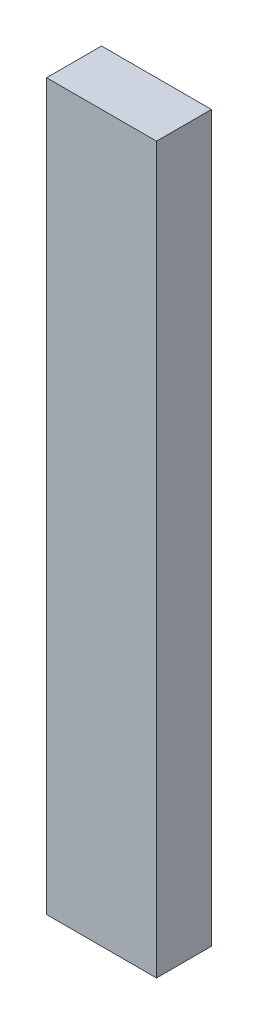
ISO-10303-21;
HEADER;
FILE_DESCRIPTION(('STEP AP214'),'2;1');
FILE_NAME('part.step','',(''),(''),'','','');
FILE_SCHEMA(('AUTOMOTIVE_DESIGN { 1 0 10303 214 1 1 1 1 }'));
ENDSEC;
DATA;
#1=APPLICATION_CONTEXT('core data for automotive mechanical design processes');
#2=APPLICATION_PROTOCOL_DEFINITION('international standard','automotive_design',2000,#1);
#3=PRODUCT_CONTEXT('',#1,'mechanical');
#4=PRODUCT('Part','Part','',(#3));
#5=PRODUCT_RELATED_PRODUCT_CATEGORY('part','',(#4));
#6=PRODUCT_DEFINITION_FORMATION('','',#4);
#7=PRODUCT_DEFINITION_CONTEXT('part definition',#1,'design');
#8=PRODUCT_DEFINITION('design','',#6,#7);
#9=PRODUCT_DEFINITION_SHAPE('','',#8);
#10=(LENGTH_UNIT() NAMED_UNIT(*) SI_UNIT(.MILLI.,.METRE.));
#11=(NAMED_UNIT(*) PLANE_ANGLE_UNIT() SI_UNIT($,.RADIAN.));
#12=(NAMED_UNIT(*) SI_UNIT($,.STERADIAN.) SOLID_ANGLE_UNIT());
#13=UNCERTAINTY_MEASURE_WITH_UNIT(LENGTH_MEASURE(1.E-05),#10,'distance_accuracy_value','');
#14=(GEOMETRIC_REPRESENTATION_CONTEXT(3) GLOBAL_UNCERTAINTY_ASSIGNED_CONTEXT((#13)) GLOBAL_UNIT_ASSIGNED_CONTEXT((#10,
#11,#12)) REPRESENTATION_CONTEXT('',''));
#15=CARTESIAN_POINT('',(0.,0.,0.));
#16=DIRECTION('',(0.,0.,1.));
#17=DIRECTION('',(1.,0.,0.));
#18=AXIS2_PLACEMENT_3D('',#15,#16,#17);
#19=CARTESIAN_POINT('',(50.8,670.,25.4));
#20=DIRECTION('',(-1.,0.,0.));
#21=DIRECTION('',(0.,0.,1.));
#22=AXIS2_PLACEMENT_3D('',#19,#20,#21);
#23=PLANE('',#22);
#24=DIRECTION('',(0.,0.,-1.));
#25=VECTOR('',#24,1.);
#26=CARTESIAN_POINT('',(50.8,0.,25.4));
#27=LINE('',#26,#25);
#28=CARTESIAN_POINT('',(50.8,0.,25.4));
#29=VERTEX_POINT('',#28);
#30=CARTESIAN_POINT('',(50.8,0.,-25.4));
#31=VERTEX_POINT('',#30);
#32=EDGE_CURVE('E113',#29,#31,#27,.T.);
#33=ORIENTED_EDGE('',*,*,#32,.T.);
#34=DIRECTION('',(0.,-1.,0.));
#35=VECTOR('',#34,1.);
#36=CARTESIAN_POINT('',(50.8,670.,-25.4));
#37=LINE('',#36,#35);
#38=CARTESIAN_POINT('',(50.8,670.,-25.4));
#39=VERTEX_POINT('',#38);
#40=EDGE_CURVE('E11',#39,#31,#37,.T.);
#41=ORIENTED_EDGE('',*,*,#40,.F.);
#42=DIRECTION('',(0.,0.,-1.));
#43=VECTOR('',#42,1.);
#44=CARTESIAN_POINT('',(50.8,670.,25.4));
#45=LINE('',#44,#43);
#46=CARTESIAN_POINT('',(50.8,670.,25.4));
#47=VERTEX_POINT('',#46);
#48=EDGE_CURVE('E97',#47,#39,#45,.T.);
#49=ORIENTED_EDGE('',*,*,#48,.F.);
#50=DIRECTION('',(0.,-1.,0.));
#51=VECTOR('',#50,1.);
#52=CARTESIAN_POINT('',(50.8,670.,25.4));
#53=LINE('',#52,#51);
#54=EDGE_CURVE('E109',#47,#29,#53,.T.);
#55=ORIENTED_EDGE('',*,*,#54,.T.);
#56=EDGE_LOOP('',(#33,#41,#49,#55));
#57=FACE_BOUND('',#56,.T.);
#58=ADVANCED_FACE('F45',(#57),#23,.F.);
#59=CARTESIAN_POINT('',(-50.8,670.,-25.4));
#60=DIRECTION('',(0.,0.,1.));
#61=DIRECTION('',(1.,0.,0.));
#62=AXIS2_PLACEMENT_3D('',#59,#60,#61);
#63=PLANE('',#62);
#64=DIRECTION('',(-1.,0.,0.));
#65=VECTOR('',#64,1.);
#66=CARTESIAN_POINT('',(-50.8,0.,-25.4));
#67=LINE('',#66,#65);
#68=CARTESIAN_POINT('',(-50.8,0.,-25.4));
#69=VERTEX_POINT('',#68);
#70=EDGE_CURVE('E102',#31,#69,#67,.T.);
#71=ORIENTED_EDGE('',*,*,#70,.T.);
#72=DIRECTION('',(0.,-1.,0.));
#73=VECTOR('',#72,1.);
#74=CARTESIAN_POINT('',(-50.8,670.,-25.4));
#75=LINE('',#74,#73);
#76=CARTESIAN_POINT('',(-50.8,670.,-25.4));
#77=VERTEX_POINT('',#76);
#78=EDGE_CURVE('E54',#77,#69,#75,.T.);
#79=ORIENTED_EDGE('',*,*,#78,.F.);
#80=DIRECTION('',(-1.,0.,0.));
#81=VECTOR('',#80,1.);
#82=CARTESIAN_POINT('',(-50.8,670.,-25.4));
#83=LINE('',#82,#81);
#84=EDGE_CURVE('E92',#39,#77,#83,.T.);
#85=ORIENTED_EDGE('',*,*,#84,.F.);
#86=ORIENTED_EDGE('',*,*,#40,.T.);
#87=EDGE_LOOP('',(#71,#79,#85,#86));
#88=FACE_BOUND('',#87,.T.);
#89=ADVANCED_FACE('F101',(#88),#63,.F.);
#90=CARTESIAN_POINT('',(-50.8,670.,25.4));
#91=DIRECTION('',(1.,0.,0.));
#92=DIRECTION('',(0.,0.,-1.));
#93=AXIS2_PLACEMENT_3D('',#90,#91,#92);
#94=PLANE('',#93);
#95=DIRECTION('',(0.,0.,1.));
#96=VECTOR('',#95,1.);
#97=CARTESIAN_POINT('',(-50.8,0.,25.4));
#98=LINE('',#97,#96);
#99=CARTESIAN_POINT('',(-50.8,0.,25.4));
#100=VERTEX_POINT('',#99);
#101=EDGE_CURVE('E79',#69,#100,#98,.T.);
#102=ORIENTED_EDGE('',*,*,#101,.T.);
#103=DIRECTION('',(0.,-1.,0.));
#104=VECTOR('',#103,1.);
#105=CARTESIAN_POINT('',(-50.8,670.,25.4));
#106=LINE('',#105,#104);
#107=CARTESIAN_POINT('',(-50.8,670.,25.4));
#108=VERTEX_POINT('',#107);
#109=EDGE_CURVE('E104',#108,#100,#106,.T.);
#110=ORIENTED_EDGE('',*,*,#109,.F.);
#111=DIRECTION('',(0.,0.,1.));
#112=VECTOR('',#111,1.);
#113=CARTESIAN_POINT('',(-50.8,670.,25.4));
#114=LINE('',#113,#112);
#115=EDGE_CURVE('E95',#77,#108,#114,.T.);
#116=ORIENTED_EDGE('',*,*,#115,.F.);
#117=ORIENTED_EDGE('',*,*,#78,.T.);
#118=EDGE_LOOP('',(#102,#110,#116,#117));
#119=FACE_BOUND('',#118,.T.);
#120=ADVANCED_FACE('F105',(#119),#94,.F.);
#121=CARTESIAN_POINT('',(-50.8,670.,25.4));
#122=DIRECTION('',(0.,0.,-1.));
#123=DIRECTION('',(-1.,0.,0.));
#124=AXIS2_PLACEMENT_3D('',#121,#122,#123);
#125=PLANE('',#124);
#126=DIRECTION('',(1.,0.,0.));
#127=VECTOR('',#126,1.);
#128=CARTESIAN_POINT('',(-50.8,0.,25.4));
#129=LINE('',#128,#127);
#130=EDGE_CURVE('E85',#100,#29,#129,.T.);
#131=ORIENTED_EDGE('',*,*,#130,.T.);
#132=ORIENTED_EDGE('',*,*,#54,.F.);
#133=DIRECTION('',(1.,0.,0.));
#134=VECTOR('',#133,1.);
#135=CARTESIAN_POINT('',(-50.8,670.,25.4));
#136=LINE('',#135,#134);
#137=EDGE_CURVE('E62',#108,#47,#136,.T.);
#138=ORIENTED_EDGE('',*,*,#137,.F.);
#139=ORIENTED_EDGE('',*,*,#109,.T.);
#140=EDGE_LOOP('',(#131,#132,#138,#139));
#141=FACE_BOUND('',#140,.T.);
#142=ADVANCED_FACE('F126',(#141),#125,.F.);
#143=CARTESIAN_POINT('',(0.,670.,0.));
#144=DIRECTION('',(0.,-1.,0.));
#145=DIRECTION('',(0.,0.,-1.));
#146=AXIS2_PLACEMENT_3D('',#143,#144,#145);
#147=PLANE('',#146);
#148=ORIENTED_EDGE('',*,*,#48,.T.);
#149=ORIENTED_EDGE('',*,*,#84,.T.);
#150=ORIENTED_EDGE('',*,*,#115,.T.);
#151=ORIENTED_EDGE('',*,*,#137,.T.);
#152=EDGE_LOOP('',(#148,#149,#150,#151));
#153=FACE_BOUND('',#152,.T.);
#154=ADVANCED_FACE('F93',(#153),#147,.F.);
#155=CARTESIAN_POINT('',(0.,0.,0.));
#156=DIRECTION('',(0.,-1.,0.));
#157=DIRECTION('',(0.,0.,-1.));
#158=AXIS2_PLACEMENT_3D('',#155,#156,#157);
#159=PLANE('',#158);
#160=ORIENTED_EDGE('',*,*,#32,.F.);
#161=ORIENTED_EDGE('',*,*,#130,.F.);
#162=ORIENTED_EDGE('',*,*,#101,.F.);
#163=ORIENTED_EDGE('',*,*,#70,.F.);
#164=EDGE_LOOP('',(#160,#161,#162,#163));
#165=FACE_BOUND('',#164,.T.);
#166=ADVANCED_FACE('F129',(#165),#159,.T.);
#167=CLOSED_SHELL('',(#58,#89,#120,#142,#154,#166));
#168=MANIFOLD_SOLID_BREP('B2',#167);
#169=ADVANCED_BREP_SHAPE_REPRESENTATION('',(#18,#168),#14);
#170=SHAPE_DEFINITION_REPRESENTATION(#9,#169);
ENDSEC;
END-ISO-10303-21;
